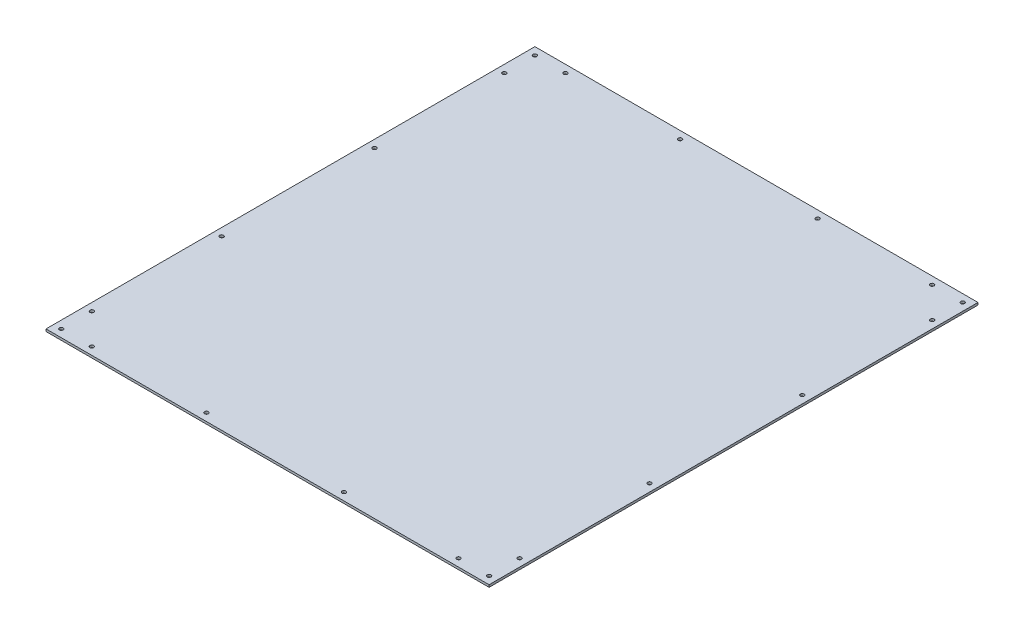
ISO-10303-21;
HEADER;
FILE_DESCRIPTION(('STEP AP214'),'2;1');
FILE_NAME('part.step','',(''),(''),'','','');
FILE_SCHEMA(('AUTOMOTIVE_DESIGN { 1 0 10303 214 1 1 1 1 }'));
ENDSEC;
DATA;
#1=APPLICATION_CONTEXT('core data for automotive mechanical design processes');
#2=APPLICATION_PROTOCOL_DEFINITION('international standard','automotive_design',2000,#1);
#3=PRODUCT_CONTEXT('',#1,'mechanical');
#4=PRODUCT('Part','Part','',(#3));
#5=PRODUCT_RELATED_PRODUCT_CATEGORY('part','',(#4));
#6=PRODUCT_DEFINITION_FORMATION('','',#4);
#7=PRODUCT_DEFINITION_CONTEXT('part definition',#1,'design');
#8=PRODUCT_DEFINITION('design','',#6,#7);
#9=PRODUCT_DEFINITION_SHAPE('','',#8);
#10=(LENGTH_UNIT() NAMED_UNIT(*) SI_UNIT(.MILLI.,.METRE.));
#11=(NAMED_UNIT(*) PLANE_ANGLE_UNIT() SI_UNIT($,.RADIAN.));
#12=(NAMED_UNIT(*) SI_UNIT($,.STERADIAN.) SOLID_ANGLE_UNIT());
#13=UNCERTAINTY_MEASURE_WITH_UNIT(LENGTH_MEASURE(1.E-05),#10,'distance_accuracy_value','');
#14=(GEOMETRIC_REPRESENTATION_CONTEXT(3) GLOBAL_UNCERTAINTY_ASSIGNED_CONTEXT((#13)) GLOBAL_UNIT_ASSIGNED_CONTEXT((#10,
#11,#12)) REPRESENTATION_CONTEXT('',''));
#15=CARTESIAN_POINT('',(0.,0.,0.));
#16=DIRECTION('',(0.,0.,1.));
#17=DIRECTION('',(1.,0.,0.));
#18=AXIS2_PLACEMENT_3D('',#15,#16,#17);
#19=CARTESIAN_POINT('',(0.,-3.,0.));
#20=DIRECTION('',(0.,-1.,0.));
#21=DIRECTION('',(1.,0.,0.));
#22=AXIS2_PLACEMENT_3D('',#19,#20,#21);
#23=PLANE('',#22);
#24=CARTESIAN_POINT('',(310.441640378549,-3.,279.085173501577));
#25=DIRECTION('',(0.,1.,0.));
#26=DIRECTION('',(0.,0.,-1.));
#27=AXIS2_PLACEMENT_3D('',#24,#25,#26);
#28=CIRCLE('',#27,2.5);
#29=CARTESIAN_POINT('',(310.441640378549,-3.,276.585173501577));
#30=VERTEX_POINT('',#29);
#31=EDGE_CURVE('E11',#30,#30,#28,.T.);
#32=ORIENTED_EDGE('',*,*,#31,.T.);
#33=EDGE_LOOP('',(#32));
#34=FACE_BOUND('',#33,.T.);
#35=CARTESIAN_POINT('',(-169.558359621451,-3.,-340.914826498423));
#36=DIRECTION('',(0.,1.,0.));
#37=DIRECTION('',(0.,0.,-1.));
#38=AXIS2_PLACEMENT_3D('',#35,#36,#37);
#39=CIRCLE('',#38,2.5);
#40=CARTESIAN_POINT('',(-169.558359621451,-3.,-343.414826498423));
#41=VERTEX_POINT('',#40);
#42=EDGE_CURVE('E23',#41,#41,#39,.T.);
#43=ORIENTED_EDGE('',*,*,#42,.T.);
#44=EDGE_LOOP('',(#43));
#45=FACE_BOUND('',#44,.T.);
#46=CARTESIAN_POINT('',(310.441640378549,-3.,-340.914826498423));
#47=DIRECTION('',(0.,-1.,0.));
#48=DIRECTION('',(0.,0.,-1.));
#49=AXIS2_PLACEMENT_3D('',#46,#47,#48);
#50=CIRCLE('',#49,2.5);
#51=CARTESIAN_POINT('',(310.441640378549,-3.,-343.414826498423));
#52=VERTEX_POINT('',#51);
#53=EDGE_CURVE('E199',#52,#52,#50,.T.);
#54=ORIENTED_EDGE('',*,*,#53,.F.);
#55=EDGE_LOOP('',(#54));
#56=FACE_BOUND('',#55,.T.);
#57=CARTESIAN_POINT('',(350.441640378549,-3.,-300.914826498423));
#58=DIRECTION('',(0.,-1.,0.));
#59=DIRECTION('',(0.,0.,-1.));
#60=AXIS2_PLACEMENT_3D('',#57,#58,#59);
#61=CIRCLE('',#60,2.5);
#62=CARTESIAN_POINT('',(350.441640378549,-3.,-303.414826498423));
#63=VERTEX_POINT('',#62);
#64=EDGE_CURVE('E196',#63,#63,#61,.T.);
#65=ORIENTED_EDGE('',*,*,#64,.F.);
#66=EDGE_LOOP('',(#65));
#67=FACE_BOUND('',#66,.T.);
#68=CARTESIAN_POINT('',(-169.558359621451,-3.,279.085173501577));
#69=DIRECTION('',(0.,-1.,0.));
#70=DIRECTION('',(0.,0.,-1.));
#71=AXIS2_PLACEMENT_3D('',#68,#69,#70);
#72=CIRCLE('',#71,2.5);
#73=CARTESIAN_POINT('',(-169.558359621451,-3.,276.585173501577));
#74=VERTEX_POINT('',#73);
#75=EDGE_CURVE('E193',#74,#74,#72,.T.);
#76=ORIENTED_EDGE('',*,*,#75,.F.);
#77=EDGE_LOOP('',(#76));
#78=FACE_BOUND('',#77,.T.);
#79=CARTESIAN_POINT('',(-19.558359621451,-3.,-340.914826498423));
#80=DIRECTION('',(0.,-1.,0.));
#81=DIRECTION('',(1.,0.,0.));
#82=AXIS2_PLACEMENT_3D('',#79,#80,#81);
#83=CIRCLE('',#82,2.5);
#84=CARTESIAN_POINT('',(-17.058359621451,-3.,-340.914826498423));
#85=VERTEX_POINT('',#84);
#86=EDGE_CURVE('E190',#85,#85,#83,.T.);
#87=ORIENTED_EDGE('',*,*,#86,.F.);
#88=EDGE_LOOP('',(#87));
#89=FACE_BOUND('',#88,.T.);
#90=CARTESIAN_POINT('',(350.441640378549,-3.,-340.914826498423));
#91=DIRECTION('',(0.,-1.,0.));
#92=DIRECTION('',(1.,0.,0.));
#93=AXIS2_PLACEMENT_3D('',#90,#91,#92);
#94=CIRCLE('',#93,2.49999999999997);
#95=CARTESIAN_POINT('',(352.941640378549,-3.,-340.914826498423));
#96=VERTEX_POINT('',#95);
#97=EDGE_CURVE('E187',#96,#96,#94,.T.);
#98=ORIENTED_EDGE('',*,*,#97,.F.);
#99=EDGE_LOOP('',(#98));
#100=FACE_BOUND('',#99,.T.);
#101=CARTESIAN_POINT('',(350.441640378549,-3.,-130.914826498423));
#102=DIRECTION('',(0.,-1.,0.));
#103=DIRECTION('',(1.,0.,0.));
#104=AXIS2_PLACEMENT_3D('',#101,#102,#103);
#105=CIRCLE('',#104,2.49999999999996);
#106=CARTESIAN_POINT('',(352.941640378549,-3.,-130.914826498423));
#107=VERTEX_POINT('',#106);
#108=EDGE_CURVE('E184',#107,#107,#105,.T.);
#109=ORIENTED_EDGE('',*,*,#108,.F.);
#110=EDGE_LOOP('',(#109));
#111=FACE_BOUND('',#110,.T.);
#112=CARTESIAN_POINT('',(350.441640378549,-3.,69.0851735015771));
#113=DIRECTION('',(0.,-1.,0.));
#114=DIRECTION('',(1.,0.,0.));
#115=AXIS2_PLACEMENT_3D('',#112,#113,#114);
#116=CIRCLE('',#115,2.49999999999997);
#117=CARTESIAN_POINT('',(352.941640378549,-3.,69.0851735015771));
#118=VERTEX_POINT('',#117);
#119=EDGE_CURVE('E181',#118,#118,#116,.T.);
#120=ORIENTED_EDGE('',*,*,#119,.F.);
#121=EDGE_LOOP('',(#120));
#122=FACE_BOUND('',#121,.T.);
#123=CARTESIAN_POINT('',(-209.558359621451,-3.,69.0851735015771));
#124=DIRECTION('',(0.,-1.,0.));
#125=DIRECTION('',(1.,0.,0.));
#126=AXIS2_PLACEMENT_3D('',#123,#124,#125);
#127=CIRCLE('',#126,2.5);
#128=CARTESIAN_POINT('',(-207.058359621451,-3.,69.0851735015771));
#129=VERTEX_POINT('',#128);
#130=EDGE_CURVE('E178',#129,#129,#127,.T.);
#131=ORIENTED_EDGE('',*,*,#130,.F.);
#132=EDGE_LOOP('',(#131));
#133=FACE_BOUND('',#132,.T.);
#134=CARTESIAN_POINT('',(-209.558359621451,-3.,-340.914826498423));
#135=DIRECTION('',(0.,-1.,0.));
#136=DIRECTION('',(1.,0.,0.));
#137=AXIS2_PLACEMENT_3D('',#134,#135,#136);
#138=CIRCLE('',#137,2.5);
#139=CARTESIAN_POINT('',(-207.058359621451,-3.,-340.914826498423));
#140=VERTEX_POINT('',#139);
#141=EDGE_CURVE('E175',#140,#140,#138,.T.);
#142=ORIENTED_EDGE('',*,*,#141,.F.);
#143=EDGE_LOOP('',(#142));
#144=FACE_BOUND('',#143,.T.);
#145=CARTESIAN_POINT('',(-209.558359621451,-3.,-130.914826498423));
#146=DIRECTION('',(0.,-1.,0.));
#147=DIRECTION('',(1.,0.,0.));
#148=AXIS2_PLACEMENT_3D('',#145,#146,#147);
#149=CIRCLE('',#148,2.5);
#150=CARTESIAN_POINT('',(-207.058359621451,-3.,-130.914826498423));
#151=VERTEX_POINT('',#150);
#152=EDGE_CURVE('E172',#151,#151,#149,.T.);
#153=ORIENTED_EDGE('',*,*,#152,.F.);
#154=EDGE_LOOP('',(#153));
#155=FACE_BOUND('',#154,.T.);
#156=CARTESIAN_POINT('',(350.441640378549,-3.,279.085173501577));
#157=DIRECTION('',(0.,-1.,0.));
#158=DIRECTION('',(1.,0.,0.));
#159=AXIS2_PLACEMENT_3D('',#156,#157,#158);
#160=CIRCLE('',#159,2.49999999999997);
#161=CARTESIAN_POINT('',(352.941640378549,-3.,279.085173501577));
#162=VERTEX_POINT('',#161);
#163=EDGE_CURVE('E169',#162,#162,#160,.T.);
#164=ORIENTED_EDGE('',*,*,#163,.F.);
#165=EDGE_LOOP('',(#164));
#166=FACE_BOUND('',#165,.T.);
#167=CARTESIAN_POINT('',(160.441640378549,-3.,279.085173501577));
#168=DIRECTION('',(0.,-1.,0.));
#169=DIRECTION('',(1.,0.,0.));
#170=AXIS2_PLACEMENT_3D('',#167,#168,#169);
#171=CIRCLE('',#170,2.5);
#172=CARTESIAN_POINT('',(162.941640378549,-3.,279.085173501577));
#173=VERTEX_POINT('',#172);
#174=EDGE_CURVE('E166',#173,#173,#171,.T.);
#175=ORIENTED_EDGE('',*,*,#174,.F.);
#176=EDGE_LOOP('',(#175));
#177=FACE_BOUND('',#176,.T.);
#178=CARTESIAN_POINT('',(-19.558359621451,-3.,279.085173501577));
#179=DIRECTION('',(0.,-1.,0.));
#180=DIRECTION('',(1.,0.,0.));
#181=AXIS2_PLACEMENT_3D('',#178,#179,#180);
#182=CIRCLE('',#181,2.5);
#183=CARTESIAN_POINT('',(-17.058359621451,-3.,279.085173501577));
#184=VERTEX_POINT('',#183);
#185=EDGE_CURVE('E163',#184,#184,#182,.T.);
#186=ORIENTED_EDGE('',*,*,#185,.F.);
#187=EDGE_LOOP('',(#186));
#188=FACE_BOUND('',#187,.T.);
#189=CARTESIAN_POINT('',(160.441640378549,-3.,-340.914826498423));
#190=DIRECTION('',(0.,-1.,0.));
#191=DIRECTION('',(1.,0.,0.));
#192=AXIS2_PLACEMENT_3D('',#189,#190,#191);
#193=CIRCLE('',#192,2.5);
#194=CARTESIAN_POINT('',(162.941640378549,-3.,-340.914826498423));
#195=VERTEX_POINT('',#194);
#196=EDGE_CURVE('E160',#195,#195,#193,.T.);
#197=ORIENTED_EDGE('',*,*,#196,.F.);
#198=EDGE_LOOP('',(#197));
#199=FACE_BOUND('',#198,.T.);
#200=CARTESIAN_POINT('',(-209.558359621451,-3.,279.085173501577));
#201=DIRECTION('',(0.,-1.,0.));
#202=DIRECTION('',(1.,0.,0.));
#203=AXIS2_PLACEMENT_3D('',#200,#201,#202);
#204=CIRCLE('',#203,2.5);
#205=CARTESIAN_POINT('',(-207.058359621451,-3.,279.085173501577));
#206=VERTEX_POINT('',#205);
#207=EDGE_CURVE('E157',#206,#206,#204,.T.);
#208=ORIENTED_EDGE('',*,*,#207,.F.);
#209=EDGE_LOOP('',(#208));
#210=FACE_BOUND('',#209,.T.);
#211=DIRECTION('',(0.,0.,-1.));
#212=VECTOR('',#211,1.);
#213=CARTESIAN_POINT('',(-219.558359621451,-3.,289.085173501577));
#214=LINE('',#213,#212);
#215=CARTESIAN_POINT('',(-219.558359621451,-3.,289.085173501577));
#216=VERTEX_POINT('',#215);
#217=CARTESIAN_POINT('',(-219.558359621451,-3.,-350.914826498423));
#218=VERTEX_POINT('',#217);
#219=EDGE_CURVE('E30',#216,#218,#214,.T.);
#220=ORIENTED_EDGE('',*,*,#219,.T.);
#221=DIRECTION('',(1.,0.,0.));
#222=VECTOR('',#221,1.);
#223=CARTESIAN_POINT('',(-219.558359621451,-3.,-350.914826498423));
#224=LINE('',#223,#222);
#225=CARTESIAN_POINT('',(360.441640378549,-3.,-350.914826498423));
#226=VERTEX_POINT('',#225);
#227=EDGE_CURVE('E35',#218,#226,#224,.T.);
#228=ORIENTED_EDGE('',*,*,#227,.T.);
#229=DIRECTION('',(0.,0.,1.));
#230=VECTOR('',#229,1.);
#231=CARTESIAN_POINT('',(360.441640378549,-3.,289.085173501577));
#232=LINE('',#231,#230);
#233=CARTESIAN_POINT('',(360.441640378549,-3.,289.085173501577));
#234=VERTEX_POINT('',#233);
#235=EDGE_CURVE('E153',#226,#234,#232,.T.);
#236=ORIENTED_EDGE('',*,*,#235,.T.);
#237=DIRECTION('',(-1.,0.,0.));
#238=VECTOR('',#237,1.);
#239=CARTESIAN_POINT('',(-219.558359621451,-3.,289.085173501577));
#240=LINE('',#239,#238);
#241=EDGE_CURVE('E151',#234,#216,#240,.T.);
#242=ORIENTED_EDGE('',*,*,#241,.T.);
#243=EDGE_LOOP('',(#220,#228,#236,#242));
#244=FACE_BOUND('',#243,.T.);
#245=CARTESIAN_POINT('',(-209.558359621451,-3.,239.085173501577));
#246=DIRECTION('',(0.,-1.,0.));
#247=DIRECTION('',(0.,0.,-1.));
#248=AXIS2_PLACEMENT_3D('',#245,#246,#247);
#249=CIRCLE('',#248,2.5);
#250=CARTESIAN_POINT('',(-209.558359621451,-3.,236.585173501577));
#251=VERTEX_POINT('',#250);
#252=EDGE_CURVE('E148',#251,#251,#249,.T.);
#253=ORIENTED_EDGE('',*,*,#252,.F.);
#254=EDGE_LOOP('',(#253));
#255=FACE_BOUND('',#254,.T.);
#256=CARTESIAN_POINT('',(350.441640378549,-3.,239.085173501577));
#257=DIRECTION('',(0.,1.,0.));
#258=DIRECTION('',(0.,0.,-1.));
#259=AXIS2_PLACEMENT_3D('',#256,#257,#258);
#260=CIRCLE('',#259,2.5);
#261=CARTESIAN_POINT('',(350.441640378549,-3.,236.585173501577));
#262=VERTEX_POINT('',#261);
#263=EDGE_CURVE('E145',#262,#262,#260,.T.);
#264=ORIENTED_EDGE('',*,*,#263,.T.);
#265=EDGE_LOOP('',(#264));
#266=FACE_BOUND('',#265,.T.);
#267=CARTESIAN_POINT('',(-209.558359621451,-3.,-300.914826498423));
#268=DIRECTION('',(0.,1.,0.));
#269=DIRECTION('',(0.,0.,-1.));
#270=AXIS2_PLACEMENT_3D('',#267,#268,#269);
#271=CIRCLE('',#270,2.5);
#272=CARTESIAN_POINT('',(-209.558359621451,-3.,-303.414826498423));
#273=VERTEX_POINT('',#272);
#274=EDGE_CURVE('E142',#273,#273,#271,.T.);
#275=ORIENTED_EDGE('',*,*,#274,.T.);
#276=EDGE_LOOP('',(#275));
#277=FACE_BOUND('',#276,.T.);
#278=ADVANCED_FACE('F16',(#34,#45,#56,#67,#78,#89,#100,#111,#122,#133,#144,#155,#166,#177,#188,
#199,#210,#244,#255,#266,#277),#23,.T.);
#279=CARTESIAN_POINT('',(0.,0.,0.));
#280=DIRECTION('',(0.,-1.,0.));
#281=DIRECTION('',(1.,0.,0.));
#282=AXIS2_PLACEMENT_3D('',#279,#280,#281);
#283=PLANE('',#282);
#284=CARTESIAN_POINT('',(-209.558359621451,0.,239.085173501577));
#285=DIRECTION('',(0.,-1.,0.));
#286=DIRECTION('',(0.,0.,-1.));
#287=AXIS2_PLACEMENT_3D('',#284,#285,#286);
#288=CIRCLE('',#287,2.5);
#289=CARTESIAN_POINT('',(-209.558359621451,0.,236.585173501577));
#290=VERTEX_POINT('',#289);
#291=EDGE_CURVE('E139',#290,#290,#288,.T.);
#292=ORIENTED_EDGE('',*,*,#291,.T.);
#293=EDGE_LOOP('',(#292));
#294=FACE_BOUND('',#293,.T.);
#295=CARTESIAN_POINT('',(310.441640378549,0.,-340.914826498423));
#296=DIRECTION('',(0.,-1.,0.));
#297=DIRECTION('',(0.,0.,-1.));
#298=AXIS2_PLACEMENT_3D('',#295,#296,#297);
#299=CIRCLE('',#298,2.5);
#300=CARTESIAN_POINT('',(310.441640378549,0.,-343.414826498423));
#301=VERTEX_POINT('',#300);
#302=EDGE_CURVE('E136',#301,#301,#299,.T.);
#303=ORIENTED_EDGE('',*,*,#302,.T.);
#304=EDGE_LOOP('',(#303));
#305=FACE_BOUND('',#304,.T.);
#306=CARTESIAN_POINT('',(350.441640378549,0.,-300.914826498423));
#307=DIRECTION('',(0.,-1.,0.));
#308=DIRECTION('',(0.,0.,-1.));
#309=AXIS2_PLACEMENT_3D('',#306,#307,#308);
#310=CIRCLE('',#309,2.5);
#311=CARTESIAN_POINT('',(350.441640378549,0.,-303.414826498423));
#312=VERTEX_POINT('',#311);
#313=EDGE_CURVE('E133',#312,#312,#310,.T.);
#314=ORIENTED_EDGE('',*,*,#313,.T.);
#315=EDGE_LOOP('',(#314));
#316=FACE_BOUND('',#315,.T.);
#317=CARTESIAN_POINT('',(-169.558359621451,0.,279.085173501577));
#318=DIRECTION('',(0.,-1.,0.));
#319=DIRECTION('',(0.,0.,-1.));
#320=AXIS2_PLACEMENT_3D('',#317,#318,#319);
#321=CIRCLE('',#320,2.5);
#322=CARTESIAN_POINT('',(-169.558359621451,0.,276.585173501577));
#323=VERTEX_POINT('',#322);
#324=EDGE_CURVE('E130',#323,#323,#321,.T.);
#325=ORIENTED_EDGE('',*,*,#324,.T.);
#326=EDGE_LOOP('',(#325));
#327=FACE_BOUND('',#326,.T.);
#328=CARTESIAN_POINT('',(-19.558359621451,0.,-340.914826498423));
#329=DIRECTION('',(0.,-1.,0.));
#330=DIRECTION('',(1.,0.,0.));
#331=AXIS2_PLACEMENT_3D('',#328,#329,#330);
#332=CIRCLE('',#331,2.5);
#333=CARTESIAN_POINT('',(-17.058359621451,0.,-340.914826498423));
#334=VERTEX_POINT('',#333);
#335=EDGE_CURVE('E127',#334,#334,#332,.T.);
#336=ORIENTED_EDGE('',*,*,#335,.T.);
#337=EDGE_LOOP('',(#336));
#338=FACE_BOUND('',#337,.T.);
#339=CARTESIAN_POINT('',(350.441640378549,0.,-340.914826498423));
#340=DIRECTION('',(0.,-1.,0.));
#341=DIRECTION('',(1.,0.,0.));
#342=AXIS2_PLACEMENT_3D('',#339,#340,#341);
#343=CIRCLE('',#342,2.49999999999997);
#344=CARTESIAN_POINT('',(352.941640378549,0.,-340.914826498423));
#345=VERTEX_POINT('',#344);
#346=EDGE_CURVE('E124',#345,#345,#343,.T.);
#347=ORIENTED_EDGE('',*,*,#346,.T.);
#348=EDGE_LOOP('',(#347));
#349=FACE_BOUND('',#348,.T.);
#350=CARTESIAN_POINT('',(350.441640378549,0.,-130.914826498423));
#351=DIRECTION('',(0.,-1.,0.));
#352=DIRECTION('',(1.,0.,0.));
#353=AXIS2_PLACEMENT_3D('',#350,#351,#352);
#354=CIRCLE('',#353,2.49999999999996);
#355=CARTESIAN_POINT('',(352.941640378549,0.,-130.914826498423));
#356=VERTEX_POINT('',#355);
#357=EDGE_CURVE('E121',#356,#356,#354,.T.);
#358=ORIENTED_EDGE('',*,*,#357,.T.);
#359=EDGE_LOOP('',(#358));
#360=FACE_BOUND('',#359,.T.);
#361=CARTESIAN_POINT('',(350.441640378549,0.,69.0851735015771));
#362=DIRECTION('',(0.,-1.,0.));
#363=DIRECTION('',(1.,0.,0.));
#364=AXIS2_PLACEMENT_3D('',#361,#362,#363);
#365=CIRCLE('',#364,2.49999999999997);
#366=CARTESIAN_POINT('',(352.941640378549,0.,69.0851735015771));
#367=VERTEX_POINT('',#366);
#368=EDGE_CURVE('E118',#367,#367,#365,.T.);
#369=ORIENTED_EDGE('',*,*,#368,.T.);
#370=EDGE_LOOP('',(#369));
#371=FACE_BOUND('',#370,.T.);
#372=CARTESIAN_POINT('',(-209.558359621451,0.,69.0851735015771));
#373=DIRECTION('',(0.,-1.,0.));
#374=DIRECTION('',(1.,0.,0.));
#375=AXIS2_PLACEMENT_3D('',#372,#373,#374);
#376=CIRCLE('',#375,2.5);
#377=CARTESIAN_POINT('',(-207.058359621451,0.,69.0851735015771));
#378=VERTEX_POINT('',#377);
#379=EDGE_CURVE('E115',#378,#378,#376,.T.);
#380=ORIENTED_EDGE('',*,*,#379,.T.);
#381=EDGE_LOOP('',(#380));
#382=FACE_BOUND('',#381,.T.);
#383=CARTESIAN_POINT('',(-209.558359621451,0.,-340.914826498423));
#384=DIRECTION('',(0.,-1.,0.));
#385=DIRECTION('',(1.,0.,0.));
#386=AXIS2_PLACEMENT_3D('',#383,#384,#385);
#387=CIRCLE('',#386,2.5);
#388=CARTESIAN_POINT('',(-207.058359621451,0.,-340.914826498423));
#389=VERTEX_POINT('',#388);
#390=EDGE_CURVE('E112',#389,#389,#387,.T.);
#391=ORIENTED_EDGE('',*,*,#390,.T.);
#392=EDGE_LOOP('',(#391));
#393=FACE_BOUND('',#392,.T.);
#394=CARTESIAN_POINT('',(-209.558359621451,0.,-130.914826498423));
#395=DIRECTION('',(0.,-1.,0.));
#396=DIRECTION('',(1.,0.,0.));
#397=AXIS2_PLACEMENT_3D('',#394,#395,#396);
#398=CIRCLE('',#397,2.5);
#399=CARTESIAN_POINT('',(-207.058359621451,0.,-130.914826498423));
#400=VERTEX_POINT('',#399);
#401=EDGE_CURVE('E109',#400,#400,#398,.T.);
#402=ORIENTED_EDGE('',*,*,#401,.T.);
#403=EDGE_LOOP('',(#402));
#404=FACE_BOUND('',#403,.T.);
#405=CARTESIAN_POINT('',(350.441640378549,0.,279.085173501577));
#406=DIRECTION('',(0.,-1.,0.));
#407=DIRECTION('',(1.,0.,0.));
#408=AXIS2_PLACEMENT_3D('',#405,#406,#407);
#409=CIRCLE('',#408,2.49999999999997);
#410=CARTESIAN_POINT('',(352.941640378549,0.,279.085173501577));
#411=VERTEX_POINT('',#410);
#412=EDGE_CURVE('E106',#411,#411,#409,.T.);
#413=ORIENTED_EDGE('',*,*,#412,.T.);
#414=EDGE_LOOP('',(#413));
#415=FACE_BOUND('',#414,.T.);
#416=CARTESIAN_POINT('',(160.441640378549,0.,279.085173501577));
#417=DIRECTION('',(0.,-1.,0.));
#418=DIRECTION('',(1.,0.,0.));
#419=AXIS2_PLACEMENT_3D('',#416,#417,#418);
#420=CIRCLE('',#419,2.5);
#421=CARTESIAN_POINT('',(162.941640378549,0.,279.085173501577));
#422=VERTEX_POINT('',#421);
#423=EDGE_CURVE('E103',#422,#422,#420,.T.);
#424=ORIENTED_EDGE('',*,*,#423,.T.);
#425=EDGE_LOOP('',(#424));
#426=FACE_BOUND('',#425,.T.);
#427=CARTESIAN_POINT('',(-19.558359621451,0.,279.085173501577));
#428=DIRECTION('',(0.,-1.,0.));
#429=DIRECTION('',(1.,0.,0.));
#430=AXIS2_PLACEMENT_3D('',#427,#428,#429);
#431=CIRCLE('',#430,2.5);
#432=CARTESIAN_POINT('',(-17.058359621451,0.,279.085173501577));
#433=VERTEX_POINT('',#432);
#434=EDGE_CURVE('E100',#433,#433,#431,.T.);
#435=ORIENTED_EDGE('',*,*,#434,.T.);
#436=EDGE_LOOP('',(#435));
#437=FACE_BOUND('',#436,.T.);
#438=CARTESIAN_POINT('',(160.441640378549,0.,-340.914826498423));
#439=DIRECTION('',(0.,-1.,0.));
#440=DIRECTION('',(1.,0.,0.));
#441=AXIS2_PLACEMENT_3D('',#438,#439,#440);
#442=CIRCLE('',#441,2.5);
#443=CARTESIAN_POINT('',(162.941640378549,0.,-340.914826498423));
#444=VERTEX_POINT('',#443);
#445=EDGE_CURVE('E97',#444,#444,#442,.T.);
#446=ORIENTED_EDGE('',*,*,#445,.T.);
#447=EDGE_LOOP('',(#446));
#448=FACE_BOUND('',#447,.T.);
#449=CARTESIAN_POINT('',(-209.558359621451,0.,279.085173501577));
#450=DIRECTION('',(0.,-1.,0.));
#451=DIRECTION('',(1.,0.,0.));
#452=AXIS2_PLACEMENT_3D('',#449,#450,#451);
#453=CIRCLE('',#452,2.5);
#454=CARTESIAN_POINT('',(-207.058359621451,0.,279.085173501577));
#455=VERTEX_POINT('',#454);
#456=EDGE_CURVE('E73',#455,#455,#453,.T.);
#457=ORIENTED_EDGE('',*,*,#456,.T.);
#458=EDGE_LOOP('',(#457));
#459=FACE_BOUND('',#458,.T.);
#460=DIRECTION('',(0.,0.,-1.));
#461=VECTOR('',#460,1.);
#462=CARTESIAN_POINT('',(-219.558359621451,0.,289.085173501577));
#463=LINE('',#462,#461);
#464=CARTESIAN_POINT('',(-219.558359621451,0.,289.085173501577));
#465=VERTEX_POINT('',#464);
#466=CARTESIAN_POINT('',(-219.558359621451,0.,-350.914826498423));
#467=VERTEX_POINT('',#466);
#468=EDGE_CURVE('E58',#465,#467,#463,.T.);
#469=ORIENTED_EDGE('',*,*,#468,.F.);
#470=DIRECTION('',(-1.,0.,0.));
#471=VECTOR('',#470,1.);
#472=CARTESIAN_POINT('',(-219.558359621451,0.,289.085173501577));
#473=LINE('',#472,#471);
#474=CARTESIAN_POINT('',(360.441640378549,0.,289.085173501577));
#475=VERTEX_POINT('',#474);
#476=EDGE_CURVE('E74',#475,#465,#473,.T.);
#477=ORIENTED_EDGE('',*,*,#476,.F.);
#478=DIRECTION('',(0.,0.,1.));
#479=VECTOR('',#478,1.);
#480=CARTESIAN_POINT('',(360.441640378549,0.,289.085173501577));
#481=LINE('',#480,#479);
#482=CARTESIAN_POINT('',(360.441640378549,0.,-350.914826498423));
#483=VERTEX_POINT('',#482);
#484=EDGE_CURVE('E61',#483,#475,#481,.T.);
#485=ORIENTED_EDGE('',*,*,#484,.F.);
#486=DIRECTION('',(1.,0.,0.));
#487=VECTOR('',#486,1.);
#488=CARTESIAN_POINT('',(-219.558359621451,0.,-350.914826498423));
#489=LINE('',#488,#487);
#490=EDGE_CURVE('E54',#467,#483,#489,.T.);
#491=ORIENTED_EDGE('',*,*,#490,.F.);
#492=EDGE_LOOP('',(#469,#477,#485,#491));
#493=FACE_BOUND('',#492,.T.);
#494=CARTESIAN_POINT('',(-169.558359621451,0.,-340.914826498423));
#495=DIRECTION('',(0.,-1.,0.));
#496=DIRECTION('',(0.,0.,-1.));
#497=AXIS2_PLACEMENT_3D('',#494,#495,#496);
#498=CIRCLE('',#497,2.5);
#499=CARTESIAN_POINT('',(-169.558359621451,0.,-343.414826498423));
#500=VERTEX_POINT('',#499);
#501=EDGE_CURVE('E65',#500,#500,#498,.F.);
#502=ORIENTED_EDGE('',*,*,#501,.F.);
#503=EDGE_LOOP('',(#502));
#504=FACE_BOUND('',#503,.T.);
#505=CARTESIAN_POINT('',(350.441640378549,0.,239.085173501577));
#506=DIRECTION('',(0.,-1.,0.));
#507=DIRECTION('',(0.,0.,-1.));
#508=AXIS2_PLACEMENT_3D('',#505,#506,#507);
#509=CIRCLE('',#508,2.5);
#510=CARTESIAN_POINT('',(350.441640378549,0.,236.585173501577));
#511=VERTEX_POINT('',#510);
#512=EDGE_CURVE('E88',#511,#511,#509,.F.);
#513=ORIENTED_EDGE('',*,*,#512,.F.);
#514=EDGE_LOOP('',(#513));
#515=FACE_BOUND('',#514,.T.);
#516=CARTESIAN_POINT('',(310.441640378549,0.,279.085173501577));
#517=DIRECTION('',(0.,-1.,0.));
#518=DIRECTION('',(0.,0.,-1.));
#519=AXIS2_PLACEMENT_3D('',#516,#517,#518);
#520=CIRCLE('',#519,2.5);
#521=CARTESIAN_POINT('',(310.441640378549,0.,276.585173501577));
#522=VERTEX_POINT('',#521);
#523=EDGE_CURVE('E80',#522,#522,#520,.F.);
#524=ORIENTED_EDGE('',*,*,#523,.F.);
#525=EDGE_LOOP('',(#524));
#526=FACE_BOUND('',#525,.T.);
#527=CARTESIAN_POINT('',(-209.558359621451,0.,-300.914826498423));
#528=DIRECTION('',(0.,-1.,0.));
#529=DIRECTION('',(0.,0.,-1.));
#530=AXIS2_PLACEMENT_3D('',#527,#528,#529);
#531=CIRCLE('',#530,2.5);
#532=CARTESIAN_POINT('',(-209.558359621451,0.,-303.414826498423));
#533=VERTEX_POINT('',#532);
#534=EDGE_CURVE('E77',#533,#533,#531,.F.);
#535=ORIENTED_EDGE('',*,*,#534,.F.);
#536=EDGE_LOOP('',(#535));
#537=FACE_BOUND('',#536,.T.);
#538=ADVANCED_FACE('F56',(#294,#305,#316,#327,#338,#349,#360,#371,#382,#393,#404,#415,#426,#437,
#448,#459,#493,#504,#515,#526,#537),#283,.F.);
#539=CARTESIAN_POINT('',(-219.558359621451,-3.,289.085173501577));
#540=DIRECTION('',(1.,0.,0.));
#541=DIRECTION('',(0.,0.,1.));
#542=AXIS2_PLACEMENT_3D('',#539,#540,#541);
#543=PLANE('',#542);
#544=ORIENTED_EDGE('',*,*,#468,.T.);
#545=DIRECTION('',(0.,1.,0.));
#546=VECTOR('',#545,1.);
#547=CARTESIAN_POINT('',(-219.558359621451,-3.,-350.914826498423));
#548=LINE('',#547,#546);
#549=EDGE_CURVE('E69',#218,#467,#548,.T.);
#550=ORIENTED_EDGE('',*,*,#549,.F.);
#551=ORIENTED_EDGE('',*,*,#219,.F.);
#552=DIRECTION('',(0.,1.,0.));
#553=VECTOR('',#552,1.);
#554=CARTESIAN_POINT('',(-219.558359621451,-3.,289.085173501577));
#555=LINE('',#554,#553);
#556=EDGE_CURVE('E71',#216,#465,#555,.T.);
#557=ORIENTED_EDGE('',*,*,#556,.T.);
#558=EDGE_LOOP('',(#544,#550,#551,#557));
#559=FACE_BOUND('',#558,.T.);
#560=ADVANCED_FACE('F68',(#559),#543,.F.);
#561=CARTESIAN_POINT('',(-219.558359621451,-3.,-350.914826498423));
#562=DIRECTION('',(0.,0.,1.));
#563=DIRECTION('',(0.,-1.,0.));
#564=AXIS2_PLACEMENT_3D('',#561,#562,#563);
#565=PLANE('',#564);
#566=ORIENTED_EDGE('',*,*,#490,.T.);
#567=DIRECTION('',(0.,1.,0.));
#568=VECTOR('',#567,1.);
#569=CARTESIAN_POINT('',(360.441640378549,-3.,-350.914826498423));
#570=LINE('',#569,#568);
#571=EDGE_CURVE('E82',#226,#483,#570,.T.);
#572=ORIENTED_EDGE('',*,*,#571,.F.);
#573=ORIENTED_EDGE('',*,*,#227,.F.);
#574=ORIENTED_EDGE('',*,*,#549,.T.);
#575=EDGE_LOOP('',(#566,#572,#573,#574));
#576=FACE_BOUND('',#575,.T.);
#577=ADVANCED_FACE('F76',(#576),#565,.F.);
#578=CARTESIAN_POINT('',(360.441640378549,-3.,289.085173501577));
#579=DIRECTION('',(-1.,0.,0.));
#580=DIRECTION('',(0.,0.,-1.));
#581=AXIS2_PLACEMENT_3D('',#578,#579,#580);
#582=PLANE('',#581);
#583=ORIENTED_EDGE('',*,*,#484,.T.);
#584=DIRECTION('',(0.,1.,0.));
#585=VECTOR('',#584,1.);
#586=CARTESIAN_POINT('',(360.441640378549,-3.,289.085173501577));
#587=LINE('',#586,#585);
#588=EDGE_CURVE('E567',#234,#475,#587,.T.);
#589=ORIENTED_EDGE('',*,*,#588,.F.);
#590=ORIENTED_EDGE('',*,*,#235,.F.);
#591=ORIENTED_EDGE('',*,*,#571,.T.);
#592=EDGE_LOOP('',(#583,#589,#590,#591));
#593=FACE_BOUND('',#592,.T.);
#594=ADVANCED_FACE('F268',(#593),#582,.F.);
#595=CARTESIAN_POINT('',(-219.558359621451,-3.,289.085173501577));
#596=DIRECTION('',(0.,0.,-1.));
#597=DIRECTION('',(0.,1.,0.));
#598=AXIS2_PLACEMENT_3D('',#595,#596,#597);
#599=PLANE('',#598);
#600=ORIENTED_EDGE('',*,*,#476,.T.);
#601=ORIENTED_EDGE('',*,*,#556,.F.);
#602=ORIENTED_EDGE('',*,*,#241,.F.);
#603=ORIENTED_EDGE('',*,*,#588,.T.);
#604=EDGE_LOOP('',(#600,#601,#602,#603));
#605=FACE_BOUND('',#604,.T.);
#606=ADVANCED_FACE('F276',(#605),#599,.F.);
#607=CARTESIAN_POINT('',(-209.558359621451,0.,279.085173501577));
#608=DIRECTION('',(0.,-1.,0.));
#609=DIRECTION('',(1.,0.,0.));
#610=AXIS2_PLACEMENT_3D('',#607,#608,#609);
#611=CYLINDRICAL_SURFACE('',#610,2.5);
#612=ORIENTED_EDGE('',*,*,#456,.F.);
#613=EDGE_LOOP('',(#612));
#614=FACE_BOUND('',#613,.T.);
#615=ORIENTED_EDGE('',*,*,#207,.T.);
#616=EDGE_LOOP('',(#615));
#617=FACE_BOUND('',#616,.T.);
#618=ADVANCED_FACE('F285',(#614,#617),#611,.F.);
#619=CARTESIAN_POINT('',(160.441640378549,0.,-340.914826498423));
#620=DIRECTION('',(0.,-1.,0.));
#621=DIRECTION('',(1.,0.,0.));
#622=AXIS2_PLACEMENT_3D('',#619,#620,#621);
#623=CYLINDRICAL_SURFACE('',#622,2.5);
#624=ORIENTED_EDGE('',*,*,#445,.F.);
#625=EDGE_LOOP('',(#624));
#626=FACE_BOUND('',#625,.T.);
#627=ORIENTED_EDGE('',*,*,#196,.T.);
#628=EDGE_LOOP('',(#627));
#629=FACE_BOUND('',#628,.T.);
#630=ADVANCED_FACE('F294',(#626,#629),#623,.F.);
#631=CARTESIAN_POINT('',(-19.558359621451,0.,279.085173501577));
#632=DIRECTION('',(0.,-1.,0.));
#633=DIRECTION('',(1.,0.,0.));
#634=AXIS2_PLACEMENT_3D('',#631,#632,#633);
#635=CYLINDRICAL_SURFACE('',#634,2.5);
#636=ORIENTED_EDGE('',*,*,#434,.F.);
#637=EDGE_LOOP('',(#636));
#638=FACE_BOUND('',#637,.T.);
#639=ORIENTED_EDGE('',*,*,#185,.T.);
#640=EDGE_LOOP('',(#639));
#641=FACE_BOUND('',#640,.T.);
#642=ADVANCED_FACE('F303',(#638,#641),#635,.F.);
#643=CARTESIAN_POINT('',(160.441640378549,0.,279.085173501577));
#644=DIRECTION('',(0.,-1.,0.));
#645=DIRECTION('',(1.,0.,0.));
#646=AXIS2_PLACEMENT_3D('',#643,#644,#645);
#647=CYLINDRICAL_SURFACE('',#646,2.5);
#648=ORIENTED_EDGE('',*,*,#423,.F.);
#649=EDGE_LOOP('',(#648));
#650=FACE_BOUND('',#649,.T.);
#651=ORIENTED_EDGE('',*,*,#174,.T.);
#652=EDGE_LOOP('',(#651));
#653=FACE_BOUND('',#652,.T.);
#654=ADVANCED_FACE('F312',(#650,#653),#647,.F.);
#655=CARTESIAN_POINT('',(350.441640378549,0.,279.085173501577));
#656=DIRECTION('',(0.,-1.,0.));
#657=DIRECTION('',(1.,0.,0.));
#658=AXIS2_PLACEMENT_3D('',#655,#656,#657);
#659=CYLINDRICAL_SURFACE('',#658,2.49999999999997);
#660=ORIENTED_EDGE('',*,*,#412,.F.);
#661=EDGE_LOOP('',(#660));
#662=FACE_BOUND('',#661,.T.);
#663=ORIENTED_EDGE('',*,*,#163,.T.);
#664=EDGE_LOOP('',(#663));
#665=FACE_BOUND('',#664,.T.);
#666=ADVANCED_FACE('F321',(#662,#665),#659,.F.);
#667=CARTESIAN_POINT('',(-209.558359621451,0.,-130.914826498423));
#668=DIRECTION('',(0.,-1.,0.));
#669=DIRECTION('',(1.,0.,0.));
#670=AXIS2_PLACEMENT_3D('',#667,#668,#669);
#671=CYLINDRICAL_SURFACE('',#670,2.5);
#672=ORIENTED_EDGE('',*,*,#401,.F.);
#673=EDGE_LOOP('',(#672));
#674=FACE_BOUND('',#673,.T.);
#675=ORIENTED_EDGE('',*,*,#152,.T.);
#676=EDGE_LOOP('',(#675));
#677=FACE_BOUND('',#676,.T.);
#678=ADVANCED_FACE('F330',(#674,#677),#671,.F.);
#679=CARTESIAN_POINT('',(-209.558359621451,0.,-340.914826498423));
#680=DIRECTION('',(0.,-1.,0.));
#681=DIRECTION('',(1.,0.,0.));
#682=AXIS2_PLACEMENT_3D('',#679,#680,#681);
#683=CYLINDRICAL_SURFACE('',#682,2.5);
#684=ORIENTED_EDGE('',*,*,#390,.F.);
#685=EDGE_LOOP('',(#684));
#686=FACE_BOUND('',#685,.T.);
#687=ORIENTED_EDGE('',*,*,#141,.T.);
#688=EDGE_LOOP('',(#687));
#689=FACE_BOUND('',#688,.T.);
#690=ADVANCED_FACE('F339',(#686,#689),#683,.F.);
#691=CARTESIAN_POINT('',(-209.558359621451,0.,69.0851735015771));
#692=DIRECTION('',(0.,-1.,0.));
#693=DIRECTION('',(1.,0.,0.));
#694=AXIS2_PLACEMENT_3D('',#691,#692,#693);
#695=CYLINDRICAL_SURFACE('',#694,2.5);
#696=ORIENTED_EDGE('',*,*,#379,.F.);
#697=EDGE_LOOP('',(#696));
#698=FACE_BOUND('',#697,.T.);
#699=ORIENTED_EDGE('',*,*,#130,.T.);
#700=EDGE_LOOP('',(#699));
#701=FACE_BOUND('',#700,.T.);
#702=ADVANCED_FACE('F348',(#698,#701),#695,.F.);
#703=CARTESIAN_POINT('',(350.441640378549,0.,69.0851735015771));
#704=DIRECTION('',(0.,-1.,0.));
#705=DIRECTION('',(1.,0.,0.));
#706=AXIS2_PLACEMENT_3D('',#703,#704,#705);
#707=CYLINDRICAL_SURFACE('',#706,2.49999999999997);
#708=ORIENTED_EDGE('',*,*,#368,.F.);
#709=EDGE_LOOP('',(#708));
#710=FACE_BOUND('',#709,.T.);
#711=ORIENTED_EDGE('',*,*,#119,.T.);
#712=EDGE_LOOP('',(#711));
#713=FACE_BOUND('',#712,.T.);
#714=ADVANCED_FACE('F357',(#710,#713),#707,.F.);
#715=CARTESIAN_POINT('',(350.441640378549,0.,-130.914826498423));
#716=DIRECTION('',(0.,-1.,0.));
#717=DIRECTION('',(1.,0.,0.));
#718=AXIS2_PLACEMENT_3D('',#715,#716,#717);
#719=CYLINDRICAL_SURFACE('',#718,2.49999999999996);
#720=ORIENTED_EDGE('',*,*,#357,.F.);
#721=EDGE_LOOP('',(#720));
#722=FACE_BOUND('',#721,.T.);
#723=ORIENTED_EDGE('',*,*,#108,.T.);
#724=EDGE_LOOP('',(#723));
#725=FACE_BOUND('',#724,.T.);
#726=ADVANCED_FACE('F366',(#722,#725),#719,.F.);
#727=CARTESIAN_POINT('',(350.441640378549,0.,-340.914826498423));
#728=DIRECTION('',(0.,-1.,0.));
#729=DIRECTION('',(1.,0.,0.));
#730=AXIS2_PLACEMENT_3D('',#727,#728,#729);
#731=CYLINDRICAL_SURFACE('',#730,2.49999999999997);
#732=ORIENTED_EDGE('',*,*,#346,.F.);
#733=EDGE_LOOP('',(#732));
#734=FACE_BOUND('',#733,.T.);
#735=ORIENTED_EDGE('',*,*,#97,.T.);
#736=EDGE_LOOP('',(#735));
#737=FACE_BOUND('',#736,.T.);
#738=ADVANCED_FACE('F375',(#734,#737),#731,.F.);
#739=CARTESIAN_POINT('',(-19.558359621451,0.,-340.914826498423));
#740=DIRECTION('',(0.,-1.,0.));
#741=DIRECTION('',(1.,0.,0.));
#742=AXIS2_PLACEMENT_3D('',#739,#740,#741);
#743=CYLINDRICAL_SURFACE('',#742,2.5);
#744=ORIENTED_EDGE('',*,*,#335,.F.);
#745=EDGE_LOOP('',(#744));
#746=FACE_BOUND('',#745,.T.);
#747=ORIENTED_EDGE('',*,*,#86,.T.);
#748=EDGE_LOOP('',(#747));
#749=FACE_BOUND('',#748,.T.);
#750=ADVANCED_FACE('F384',(#746,#749),#743,.F.);
#751=CARTESIAN_POINT('',(-169.558359621451,22.,279.085173501577));
#752=DIRECTION('',(0.,-1.,0.));
#753=DIRECTION('',(0.,0.,-1.));
#754=AXIS2_PLACEMENT_3D('',#751,#752,#753);
#755=CYLINDRICAL_SURFACE('',#754,2.5);
#756=ORIENTED_EDGE('',*,*,#75,.T.);
#757=EDGE_LOOP('',(#756));
#758=FACE_BOUND('',#757,.T.);
#759=ORIENTED_EDGE('',*,*,#324,.F.);
#760=EDGE_LOOP('',(#759));
#761=FACE_BOUND('',#760,.T.);
#762=ADVANCED_FACE('F393',(#758,#761),#755,.F.);
#763=CARTESIAN_POINT('',(350.441640378549,22.,-300.914826498423));
#764=DIRECTION('',(0.,-1.,0.));
#765=DIRECTION('',(0.,0.,-1.));
#766=AXIS2_PLACEMENT_3D('',#763,#764,#765);
#767=CYLINDRICAL_SURFACE('',#766,2.5);
#768=ORIENTED_EDGE('',*,*,#64,.T.);
#769=EDGE_LOOP('',(#768));
#770=FACE_BOUND('',#769,.T.);
#771=ORIENTED_EDGE('',*,*,#313,.F.);
#772=EDGE_LOOP('',(#771));
#773=FACE_BOUND('',#772,.T.);
#774=ADVANCED_FACE('F402',(#770,#773),#767,.F.);
#775=CARTESIAN_POINT('',(310.441640378549,22.,-340.914826498423));
#776=DIRECTION('',(0.,-1.,0.));
#777=DIRECTION('',(0.,0.,-1.));
#778=AXIS2_PLACEMENT_3D('',#775,#776,#777);
#779=CYLINDRICAL_SURFACE('',#778,2.5);
#780=ORIENTED_EDGE('',*,*,#53,.T.);
#781=EDGE_LOOP('',(#780));
#782=FACE_BOUND('',#781,.T.);
#783=ORIENTED_EDGE('',*,*,#302,.F.);
#784=EDGE_LOOP('',(#783));
#785=FACE_BOUND('',#784,.T.);
#786=ADVANCED_FACE('F210',(#782,#785),#779,.F.);
#787=CARTESIAN_POINT('',(-169.558359621451,22.,-340.914826498423));
#788=DIRECTION('',(0.,-1.,0.));
#789=DIRECTION('',(0.,0.,-1.));
#790=AXIS2_PLACEMENT_3D('',#787,#788,#789);
#791=CYLINDRICAL_SURFACE('',#790,2.5);
#792=ORIENTED_EDGE('',*,*,#42,.F.);
#793=EDGE_LOOP('',(#792));
#794=FACE_BOUND('',#793,.T.);
#795=ORIENTED_EDGE('',*,*,#501,.T.);
#796=EDGE_LOOP('',(#795));
#797=FACE_BOUND('',#796,.T.);
#798=ADVANCED_FACE('F206',(#794,#797),#791,.F.);
#799=CARTESIAN_POINT('',(-209.558359621451,22.,239.085173501577));
#800=DIRECTION('',(0.,-1.,0.));
#801=DIRECTION('',(0.,0.,-1.));
#802=AXIS2_PLACEMENT_3D('',#799,#800,#801);
#803=CYLINDRICAL_SURFACE('',#802,2.5);
#804=ORIENTED_EDGE('',*,*,#252,.T.);
#805=EDGE_LOOP('',(#804));
#806=FACE_BOUND('',#805,.T.);
#807=ORIENTED_EDGE('',*,*,#291,.F.);
#808=EDGE_LOOP('',(#807));
#809=FACE_BOUND('',#808,.T.);
#810=ADVANCED_FACE('F209',(#806,#809),#803,.F.);
#811=CARTESIAN_POINT('',(350.441640378549,22.,239.085173501577));
#812=DIRECTION('',(0.,-1.,0.));
#813=DIRECTION('',(0.,0.,-1.));
#814=AXIS2_PLACEMENT_3D('',#811,#812,#813);
#815=CYLINDRICAL_SURFACE('',#814,2.5);
#816=ORIENTED_EDGE('',*,*,#263,.F.);
#817=EDGE_LOOP('',(#816));
#818=FACE_BOUND('',#817,.T.);
#819=ORIENTED_EDGE('',*,*,#512,.T.);
#820=EDGE_LOOP('',(#819));
#821=FACE_BOUND('',#820,.T.);
#822=ADVANCED_FACE('F231',(#818,#821),#815,.F.);
#823=CARTESIAN_POINT('',(310.441640378549,22.,279.085173501577));
#824=DIRECTION('',(0.,-1.,0.));
#825=DIRECTION('',(0.,0.,-1.));
#826=AXIS2_PLACEMENT_3D('',#823,#824,#825);
#827=CYLINDRICAL_SURFACE('',#826,2.5);
#828=ORIENTED_EDGE('',*,*,#31,.F.);
#829=EDGE_LOOP('',(#828));
#830=FACE_BOUND('',#829,.T.);
#831=ORIENTED_EDGE('',*,*,#523,.T.);
#832=EDGE_LOOP('',(#831));
#833=FACE_BOUND('',#832,.T.);
#834=ADVANCED_FACE('F224',(#830,#833),#827,.F.);
#835=CARTESIAN_POINT('',(-209.558359621451,22.,-300.914826498423));
#836=DIRECTION('',(0.,-1.,0.));
#837=DIRECTION('',(0.,0.,-1.));
#838=AXIS2_PLACEMENT_3D('',#835,#836,#837);
#839=CYLINDRICAL_SURFACE('',#838,2.5);
#840=ORIENTED_EDGE('',*,*,#274,.F.);
#841=EDGE_LOOP('',(#840));
#842=FACE_BOUND('',#841,.T.);
#843=ORIENTED_EDGE('',*,*,#534,.T.);
#844=EDGE_LOOP('',(#843));
#845=FACE_BOUND('',#844,.T.);
#846=ADVANCED_FACE('F222',(#842,#845),#839,.F.);
#847=CLOSED_SHELL('',(#278,#538,#560,#577,#594,#606,#618,#630,#642,#654,#666,#678,#690,#702,
#714,#726,#738,#750,#762,#774,#786,#798,#810,#822,#834,#846));
#848=MANIFOLD_SOLID_BREP('B1',#847);
#849=ADVANCED_BREP_SHAPE_REPRESENTATION('',(#18,#848),#14);
#850=SHAPE_DEFINITION_REPRESENTATION(#9,#849);
ENDSEC;
END-ISO-10303-21;
